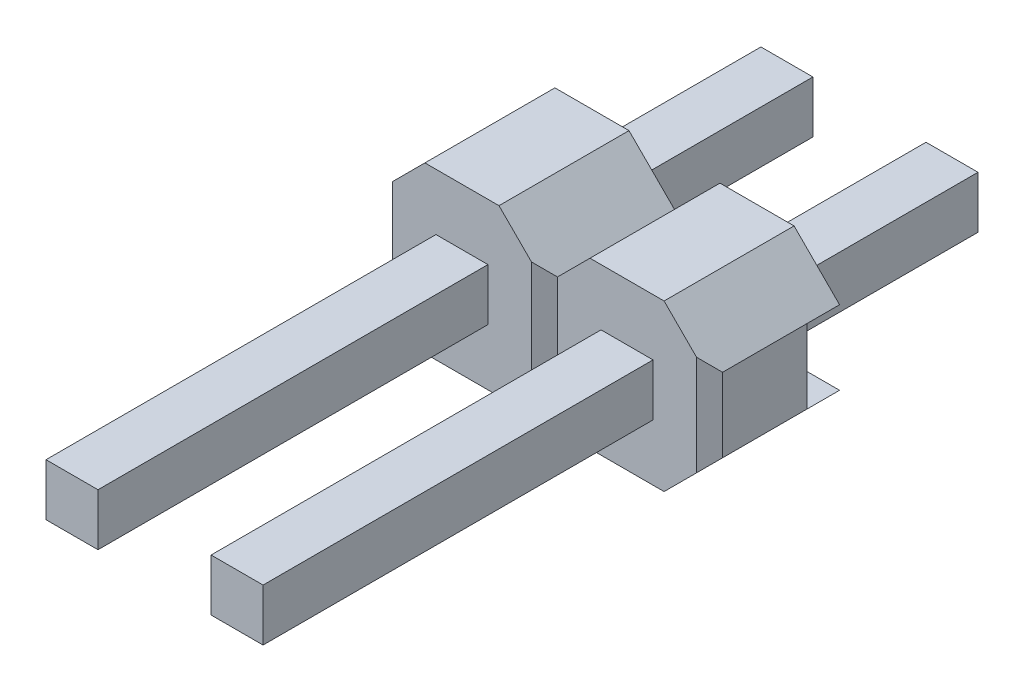
ISO-10303-21;
HEADER;
FILE_DESCRIPTION(('STEP AP214'),'2;1');
FILE_NAME('part.step','',(''),(''),'','','');
FILE_SCHEMA(('AUTOMOTIVE_DESIGN { 1 0 10303 214 1 1 1 1 }'));
ENDSEC;
DATA;
#1=APPLICATION_CONTEXT('core data for automotive mechanical design processes');
#2=APPLICATION_PROTOCOL_DEFINITION('international standard','automotive_design',2000,#1);
#3=PRODUCT_CONTEXT('',#1,'mechanical');
#4=PRODUCT('Part','Part','',(#3));
#5=PRODUCT_RELATED_PRODUCT_CATEGORY('part','',(#4));
#6=PRODUCT_DEFINITION_FORMATION('','',#4);
#7=PRODUCT_DEFINITION_CONTEXT('part definition',#1,'design');
#8=PRODUCT_DEFINITION('design','',#6,#7);
#9=PRODUCT_DEFINITION_SHAPE('','',#8);
#10=(LENGTH_UNIT() NAMED_UNIT(*) SI_UNIT(.MILLI.,.METRE.));
#11=(NAMED_UNIT(*) PLANE_ANGLE_UNIT() SI_UNIT($,.RADIAN.));
#12=(NAMED_UNIT(*) SI_UNIT($,.STERADIAN.) SOLID_ANGLE_UNIT());
#13=UNCERTAINTY_MEASURE_WITH_UNIT(LENGTH_MEASURE(1.E-05),#10,'distance_accuracy_value','');
#14=(GEOMETRIC_REPRESENTATION_CONTEXT(3) GLOBAL_UNCERTAINTY_ASSIGNED_CONTEXT((#13)) GLOBAL_UNIT_ASSIGNED_CONTEXT((#10,
#11,#12)) REPRESENTATION_CONTEXT('',''));
#15=CARTESIAN_POINT('',(0.,0.,0.));
#16=DIRECTION('',(0.,0.,1.));
#17=DIRECTION('',(1.,0.,0.));
#18=AXIS2_PLACEMENT_3D('',#15,#16,#17);
#19=CARTESIAN_POINT('',(-2.5654,-1.2954,0.));
#20=DIRECTION('',(0.,0.,-1.));
#21=DIRECTION('',(-1.,0.,0.));
#22=AXIS2_PLACEMENT_3D('',#19,#20,#21);
#23=PLANE('',#22);
#24=DIRECTION('',(0.707106781186547,-0.707106781186548,0.));
#25=VECTOR('',#24,1.);
#26=CARTESIAN_POINT('',(-0.7,1.27,0.));
#27=LINE('',#26,#25);
#28=CARTESIAN_POINT('',(-0.7,1.27,0.));
#29=VERTEX_POINT('',#28);
#30=CARTESIAN_POINT('',(0.,0.57,0.));
#31=VERTEX_POINT('',#30);
#32=EDGE_CURVE('P0_E101',#29,#31,#27,.T.);
#33=ORIENTED_EDGE('',*,*,#32,.T.);
#34=DIRECTION('',(1.,0.,0.));
#35=VECTOR('',#34,1.);
#36=CARTESIAN_POINT('',(0.,0.57,0.));
#37=LINE('',#36,#35);
#38=CARTESIAN_POINT('',(-2.54,0.57,0.));
#39=VERTEX_POINT('',#38);
#40=EDGE_CURVE('P0_E120',#39,#31,#37,.T.);
#41=ORIENTED_EDGE('',*,*,#40,.F.);
#42=DIRECTION('',(0.707106781186547,0.707106781186547,0.));
#43=VECTOR('',#42,1.);
#44=CARTESIAN_POINT('',(-2.54,0.57,0.));
#45=LINE('',#44,#43);
#46=CARTESIAN_POINT('',(-1.84,1.27,0.));
#47=VERTEX_POINT('',#46);
#48=EDGE_CURVE('P0_E18',#39,#47,#45,.T.);
#49=ORIENTED_EDGE('',*,*,#48,.T.);
#50=DIRECTION('',(-1.,0.,0.));
#51=VECTOR('',#50,1.);
#52=CARTESIAN_POINT('',(-2.5654,1.27,0.));
#53=LINE('',#52,#51);
#54=EDGE_CURVE('P0_E106',#47,#29,#53,.F.);
#55=ORIENTED_EDGE('',*,*,#54,.T.);
#56=EDGE_LOOP('',(#33,#41,#49,#55));
#57=FACE_BOUND('',#56,.T.);
#58=ADVANCED_FACE('P0_F15',(#57),#23,.T.);
#59=CARTESIAN_POINT('',(0.,0.57,0.));
#60=DIRECTION('',(0.,-1.,0.));
#61=DIRECTION('',(0.,0.,-1.));
#62=AXIS2_PLACEMENT_3D('',#59,#60,#61);
#63=PLANE('',#62);
#64=DIRECTION('',(0.,0.,-1.));
#65=VECTOR('',#64,1.);
#66=CARTESIAN_POINT('',(-2.54,0.57,0.));
#67=LINE('',#66,#65);
#68=CARTESIAN_POINT('',(-2.54,0.57,0.5));
#69=VERTEX_POINT('',#68);
#70=EDGE_CURVE('P0_E124',#69,#39,#67,.T.);
#71=ORIENTED_EDGE('',*,*,#70,.T.);
#72=ORIENTED_EDGE('',*,*,#40,.T.);
#73=DIRECTION('',(0.,0.,-1.));
#74=VECTOR('',#73,1.);
#75=CARTESIAN_POINT('',(0.,0.57,0.));
#76=LINE('',#75,#74);
#77=CARTESIAN_POINT('',(0.,0.57,0.5));
#78=VERTEX_POINT('',#77);
#79=EDGE_CURVE('P0_E132',#31,#78,#76,.F.);
#80=ORIENTED_EDGE('',*,*,#79,.T.);
#81=DIRECTION('',(-1.,0.,0.));
#82=VECTOR('',#81,1.);
#83=CARTESIAN_POINT('',(-2.54,0.57,0.5));
#84=LINE('',#83,#82);
#85=EDGE_CURVE('P0_E129',#69,#78,#84,.F.);
#86=ORIENTED_EDGE('',*,*,#85,.F.);
#87=EDGE_LOOP('',(#71,#72,#80,#86));
#88=FACE_BOUND('',#87,.T.);
#89=ADVANCED_FACE('P0_F127',(#88),#63,.T.);
#90=CARTESIAN_POINT('',(-2.54,-0.57,0.5));
#91=DIRECTION('',(0.,0.,-1.));
#92=DIRECTION('',(-1.,0.,0.));
#93=AXIS2_PLACEMENT_3D('',#90,#91,#92);
#94=PLANE('',#93);
#95=DIRECTION('',(0.,1.,0.));
#96=VECTOR('',#95,1.);
#97=CARTESIAN_POINT('',(0.,-0.57,0.5));
#98=LINE('',#97,#96);
#99=CARTESIAN_POINT('',(0.,-0.57,0.5));
#100=VERTEX_POINT('',#99);
#101=EDGE_CURVE('P0_E139',#78,#100,#98,.F.);
#102=ORIENTED_EDGE('',*,*,#101,.T.);
#103=DIRECTION('',(1.,0.,0.));
#104=VECTOR('',#103,1.);
#105=CARTESIAN_POINT('',(-2.54,-0.57,0.5));
#106=LINE('',#105,#104);
#107=CARTESIAN_POINT('',(-2.54,-0.57,0.5));
#108=VERTEX_POINT('',#107);
#109=EDGE_CURVE('P0_E144',#108,#100,#106,.T.);
#110=ORIENTED_EDGE('',*,*,#109,.F.);
#111=DIRECTION('',(0.,1.,0.));
#112=VECTOR('',#111,1.);
#113=CARTESIAN_POINT('',(-2.54,-0.57,0.5));
#114=LINE('',#113,#112);
#115=EDGE_CURVE('P0_E123',#108,#69,#114,.T.);
#116=ORIENTED_EDGE('',*,*,#115,.T.);
#117=ORIENTED_EDGE('',*,*,#85,.T.);
#118=EDGE_LOOP('',(#102,#110,#116,#117));
#119=FACE_BOUND('',#118,.T.);
#120=ADVANCED_FACE('P0_F266',(#119),#94,.T.);
#121=CARTESIAN_POINT('',(-2.54,-0.57,0.));
#122=DIRECTION('',(0.,1.,0.));
#123=DIRECTION('',(0.,0.,1.));
#124=AXIS2_PLACEMENT_3D('',#121,#122,#123);
#125=PLANE('',#124);
#126=DIRECTION('',(0.,0.,1.));
#127=VECTOR('',#126,1.);
#128=CARTESIAN_POINT('',(0.,-0.57,0.));
#129=LINE('',#128,#127);
#130=CARTESIAN_POINT('',(0.,-0.57,0.));
#131=VERTEX_POINT('',#130);
#132=EDGE_CURVE('P0_E147',#100,#131,#129,.F.);
#133=ORIENTED_EDGE('',*,*,#132,.T.);
#134=DIRECTION('',(-1.,0.,0.));
#135=VECTOR('',#134,1.);
#136=CARTESIAN_POINT('',(-2.5654,-0.570000000000001,0.));
#137=LINE('',#136,#135);
#138=CARTESIAN_POINT('',(-2.54,-0.570000000000001,0.));
#139=VERTEX_POINT('',#138);
#140=EDGE_CURVE('P0_E152',#139,#131,#137,.F.);
#141=ORIENTED_EDGE('',*,*,#140,.F.);
#142=DIRECTION('',(0.,0.,1.));
#143=VECTOR('',#142,1.);
#144=CARTESIAN_POINT('',(-2.54,-0.57,0.));
#145=LINE('',#144,#143);
#146=EDGE_CURVE('P0_E141',#139,#108,#145,.T.);
#147=ORIENTED_EDGE('',*,*,#146,.T.);
#148=ORIENTED_EDGE('',*,*,#109,.T.);
#149=EDGE_LOOP('',(#133,#141,#147,#148));
#150=FACE_BOUND('',#149,.T.);
#151=ADVANCED_FACE('P0_F263',(#150),#125,.T.);
#152=CARTESIAN_POINT('',(-2.5654,-1.2954,0.));
#153=DIRECTION('',(0.,0.,-1.));
#154=DIRECTION('',(-1.,0.,0.));
#155=AXIS2_PLACEMENT_3D('',#152,#153,#154);
#156=PLANE('',#155);
#157=DIRECTION('',(-0.707106781186548,0.707106781186547,0.));
#158=VECTOR('',#157,1.);
#159=CARTESIAN_POINT('',(-1.84,-1.27,0.));
#160=LINE('',#159,#158);
#161=CARTESIAN_POINT('',(-1.84,-1.27,0.));
#162=VERTEX_POINT('',#161);
#163=EDGE_CURVE('P0_E149',#162,#139,#160,.T.);
#164=ORIENTED_EDGE('',*,*,#163,.T.);
#165=ORIENTED_EDGE('',*,*,#140,.T.);
#166=DIRECTION('',(0.707106781186548,0.707106781186547,0.));
#167=VECTOR('',#166,1.);
#168=CARTESIAN_POINT('',(-0.7,-1.27,0.));
#169=LINE('',#168,#167);
#170=CARTESIAN_POINT('',(-0.7,-1.27,0.));
#171=VERTEX_POINT('',#170);
#172=EDGE_CURVE('P0_E157',#171,#131,#169,.T.);
#173=ORIENTED_EDGE('',*,*,#172,.F.);
#174=DIRECTION('',(1.,0.,0.));
#175=VECTOR('',#174,1.);
#176=CARTESIAN_POINT('',(0.,-1.27,0.));
#177=LINE('',#176,#175);
#178=EDGE_CURVE('P0_E166',#162,#171,#177,.T.);
#179=ORIENTED_EDGE('',*,*,#178,.F.);
#180=EDGE_LOOP('',(#164,#165,#173,#179));
#181=FACE_BOUND('',#180,.T.);
#182=ADVANCED_FACE('P0_F268',(#181),#156,.T.);
#183=CARTESIAN_POINT('',(-0.7,-1.27,16.));
#184=DIRECTION('',(0.707106781186547,-0.707106781186548,0.));
#185=DIRECTION('',(0.707106781186548,0.707106781186547,0.));
#186=AXIS2_PLACEMENT_3D('',#183,#184,#185);
#187=PLANE('',#186);
#188=DIRECTION('',(0.,0.,1.));
#189=VECTOR('',#188,1.);
#190=CARTESIAN_POINT('',(0.,-0.570000000000001,16.));
#191=LINE('',#190,#189);
#192=CARTESIAN_POINT('',(0.,-0.57,1.8));
#193=VERTEX_POINT('',#192);
#194=EDGE_CURVE('P0_E160',#100,#193,#191,.T.);
#195=ORIENTED_EDGE('',*,*,#194,.T.);
#196=DIRECTION('',(-0.577350269189626,-0.577350269189625,0.577350269189626));
#197=VECTOR('',#196,1.);
#198=CARTESIAN_POINT('',(0.,-0.570000000000001,1.8));
#199=LINE('',#198,#197);
#200=CARTESIAN_POINT('',(-0.2,-0.770000000000001,2.));
#201=VERTEX_POINT('',#200);
#202=EDGE_CURVE('P0_E163',#193,#201,#199,.T.);
#203=ORIENTED_EDGE('',*,*,#202,.T.);
#204=DIRECTION('',(0.707106781186548,0.707106781186547,0.));
#205=VECTOR('',#204,1.);
#206=CARTESIAN_POINT('',(-0.7,-1.27,2.));
#207=LINE('',#206,#205);
#208=CARTESIAN_POINT('',(-0.7,-1.27,2.));
#209=VERTEX_POINT('',#208);
#210=EDGE_CURVE('P0_E155',#201,#209,#207,.F.);
#211=ORIENTED_EDGE('',*,*,#210,.T.);
#212=DIRECTION('',(0.,0.,-1.));
#213=VECTOR('',#212,1.);
#214=CARTESIAN_POINT('',(-0.7,-1.27,0.));
#215=LINE('',#214,#213);
#216=EDGE_CURVE('P0_E169',#171,#209,#215,.F.);
#217=ORIENTED_EDGE('',*,*,#216,.F.);
#218=ORIENTED_EDGE('',*,*,#172,.T.);
#219=ORIENTED_EDGE('',*,*,#132,.F.);
#220=EDGE_LOOP('',(#195,#203,#211,#217,#218,#219));
#221=FACE_BOUND('',#220,.T.);
#222=ADVANCED_FACE('P0_F257',(#221),#187,.T.);
#223=CARTESIAN_POINT('',(0.,-1.27,0.));
#224=DIRECTION('',(0.,-1.,0.));
#225=DIRECTION('',(0.,0.,-1.));
#226=AXIS2_PLACEMENT_3D('',#223,#224,#225);
#227=PLANE('',#226);
#228=ORIENTED_EDGE('',*,*,#216,.T.);
#229=DIRECTION('',(1.,0.,0.));
#230=VECTOR('',#229,1.);
#231=CARTESIAN_POINT('',(0.,-1.27,2.));
#232=LINE('',#231,#230);
#233=CARTESIAN_POINT('',(-1.84,-1.27,2.));
#234=VERTEX_POINT('',#233);
#235=EDGE_CURVE('P0_E172',#209,#234,#232,.F.);
#236=ORIENTED_EDGE('',*,*,#235,.T.);
#237=DIRECTION('',(0.,0.,1.));
#238=VECTOR('',#237,1.);
#239=CARTESIAN_POINT('',(-1.84,-1.27,16.));
#240=LINE('',#239,#238);
#241=EDGE_CURVE('P0_E174',#162,#234,#240,.T.);
#242=ORIENTED_EDGE('',*,*,#241,.F.);
#243=ORIENTED_EDGE('',*,*,#178,.T.);
#244=EDGE_LOOP('',(#228,#236,#242,#243));
#245=FACE_BOUND('',#244,.T.);
#246=ADVANCED_FACE('P0_F253',(#245),#227,.T.);
#247=CARTESIAN_POINT('',(-2.54,-0.570000000000001,16.));
#248=DIRECTION('',(-0.707106781186548,-0.707106781186547,0.));
#249=DIRECTION('',(0.707106781186547,-0.707106781186548,0.));
#250=AXIS2_PLACEMENT_3D('',#247,#248,#249);
#251=PLANE('',#250);
#252=DIRECTION('',(0.707106781186547,-0.707106781186548,0.));
#253=VECTOR('',#252,1.);
#254=CARTESIAN_POINT('',(-2.54,-0.570000000000001,2.));
#255=LINE('',#254,#253);
#256=CARTESIAN_POINT('',(-2.34,-0.77,2.));
#257=VERTEX_POINT('',#256);
#258=EDGE_CURVE('P0_E177',#234,#257,#255,.F.);
#259=ORIENTED_EDGE('',*,*,#258,.T.);
#260=DIRECTION('',(-0.577350269189625,0.577350269189626,-0.577350269189626));
#261=VECTOR('',#260,1.);
#262=CARTESIAN_POINT('',(-2.34,-0.770000000000001,2.));
#263=LINE('',#262,#261);
#264=CARTESIAN_POINT('',(-2.54,-0.57,1.8));
#265=VERTEX_POINT('',#264);
#266=EDGE_CURVE('P0_E180',#257,#265,#263,.T.);
#267=ORIENTED_EDGE('',*,*,#266,.T.);
#268=DIRECTION('',(0.,0.,1.));
#269=VECTOR('',#268,1.);
#270=CARTESIAN_POINT('',(-2.54,-0.57,0.));
#271=LINE('',#270,#269);
#272=EDGE_CURVE('P0_E190',#108,#265,#271,.T.);
#273=ORIENTED_EDGE('',*,*,#272,.F.);
#274=ORIENTED_EDGE('',*,*,#146,.F.);
#275=ORIENTED_EDGE('',*,*,#163,.F.);
#276=ORIENTED_EDGE('',*,*,#241,.T.);
#277=EDGE_LOOP('',(#259,#267,#273,#274,#275,#276));
#278=FACE_BOUND('',#277,.T.);
#279=ADVANCED_FACE('P0_F223',(#278),#251,.T.);
#280=CARTESIAN_POINT('',(0.,1.27,0.));
#281=DIRECTION('',(1.,0.,0.));
#282=DIRECTION('',(0.,0.,-1.));
#283=AXIS2_PLACEMENT_3D('',#280,#281,#282);
#284=PLANE('',#283);
#285=DIRECTION('',(0.,1.,0.));
#286=VECTOR('',#285,1.);
#287=CARTESIAN_POINT('',(0.,4.60999999999997,1.8));
#288=LINE('',#287,#286);
#289=CARTESIAN_POINT('',(0.,0.57,1.8));
#290=VERTEX_POINT('',#289);
#291=EDGE_CURVE('P0_E198',#193,#290,#288,.T.);
#292=ORIENTED_EDGE('',*,*,#291,.F.);
#293=ORIENTED_EDGE('',*,*,#194,.F.);
#294=ORIENTED_EDGE('',*,*,#101,.F.);
#295=DIRECTION('',(0.,0.,1.));
#296=VECTOR('',#295,1.);
#297=CARTESIAN_POINT('',(0.,0.57,16.));
#298=LINE('',#297,#296);
#299=EDGE_CURVE('P0_E182',#290,#78,#298,.F.);
#300=ORIENTED_EDGE('',*,*,#299,.F.);
#301=EDGE_LOOP('',(#292,#293,#294,#300));
#302=FACE_BOUND('',#301,.T.);
#303=ADVANCED_FACE('P0_F214',(#302),#284,.T.);
#304=CARTESIAN_POINT('',(0.,0.569999999999999,16.));
#305=DIRECTION('',(0.707106781186548,0.707106781186547,0.));
#306=DIRECTION('',(-0.707106781186547,0.707106781186548,0.));
#307=AXIS2_PLACEMENT_3D('',#304,#305,#306);
#308=PLANE('',#307);
#309=DIRECTION('',(-0.707106781186547,0.707106781186548,0.));
#310=VECTOR('',#309,1.);
#311=CARTESIAN_POINT('',(0.,0.569999999999999,2.));
#312=LINE('',#311,#310);
#313=CARTESIAN_POINT('',(-0.7,1.27,2.));
#314=VERTEX_POINT('',#313);
#315=CARTESIAN_POINT('',(-0.200000000000001,0.770000000000001,2.));
#316=VERTEX_POINT('',#315);
#317=EDGE_CURVE('P0_E185',#314,#316,#312,.F.);
#318=ORIENTED_EDGE('',*,*,#317,.T.);
#319=DIRECTION('',(-0.577350269189625,0.577350269189628,0.577350269189625));
#320=VECTOR('',#319,1.);
#321=CARTESIAN_POINT('',(0.,0.57,1.8));
#322=LINE('',#321,#320);
#323=EDGE_CURVE('P0_E195',#290,#316,#322,.T.);
#324=ORIENTED_EDGE('',*,*,#323,.F.);
#325=ORIENTED_EDGE('',*,*,#299,.T.);
#326=ORIENTED_EDGE('',*,*,#79,.F.);
#327=ORIENTED_EDGE('',*,*,#32,.F.);
#328=DIRECTION('',(0.,0.,1.));
#329=VECTOR('',#328,1.);
#330=CARTESIAN_POINT('',(-0.699999999999999,1.27,0.));
#331=LINE('',#330,#329);
#332=EDGE_CURVE('P0_E111',#314,#29,#331,.F.);
#333=ORIENTED_EDGE('',*,*,#332,.F.);
#334=EDGE_LOOP('',(#318,#324,#325,#326,#327,#333));
#335=FACE_BOUND('',#334,.T.);
#336=ADVANCED_FACE('P0_F212',(#335),#308,.T.);
#337=CARTESIAN_POINT('',(-2.54,0.57,-14.));
#338=DIRECTION('',(-0.707106781186548,0.707106781186547,0.));
#339=DIRECTION('',(-0.707106781186547,-0.707106781186548,0.));
#340=AXIS2_PLACEMENT_3D('',#337,#338,#339);
#341=PLANE('',#340);
#342=DIRECTION('',(0.,0.,1.));
#343=VECTOR('',#342,1.);
#344=CARTESIAN_POINT('',(-2.54,0.57,0.));
#345=LINE('',#344,#343);
#346=CARTESIAN_POINT('',(-2.54,0.57,1.8));
#347=VERTEX_POINT('',#346);
#348=EDGE_CURVE('P0_E193',#347,#69,#345,.F.);
#349=ORIENTED_EDGE('',*,*,#348,.F.);
#350=DIRECTION('',(0.577350269189627,0.577350269189628,0.577350269189622));
#351=VECTOR('',#350,1.);
#352=CARTESIAN_POINT('',(-2.54,0.57,1.8));
#353=LINE('',#352,#351);
#354=CARTESIAN_POINT('',(-2.34,0.770000000000001,2.));
#355=VERTEX_POINT('',#354);
#356=EDGE_CURVE('P0_E188',#347,#355,#353,.T.);
#357=ORIENTED_EDGE('',*,*,#356,.T.);
#358=DIRECTION('',(-0.707106781186547,-0.707106781186548,0.));
#359=VECTOR('',#358,1.);
#360=CARTESIAN_POINT('',(-2.54,0.57,2.));
#361=LINE('',#360,#359);
#362=CARTESIAN_POINT('',(-1.84,1.27,2.));
#363=VERTEX_POINT('',#362);
#364=EDGE_CURVE('P0_E33',#355,#363,#361,.F.);
#365=ORIENTED_EDGE('',*,*,#364,.T.);
#366=DIRECTION('',(0.,0.,1.));
#367=VECTOR('',#366,1.);
#368=CARTESIAN_POINT('',(-1.84,1.27,0.));
#369=LINE('',#368,#367);
#370=EDGE_CURVE('P0_E109',#47,#363,#369,.T.);
#371=ORIENTED_EDGE('',*,*,#370,.F.);
#372=ORIENTED_EDGE('',*,*,#48,.F.);
#373=ORIENTED_EDGE('',*,*,#70,.F.);
#374=EDGE_LOOP('',(#349,#357,#365,#371,#372,#373));
#375=FACE_BOUND('',#374,.T.);
#376=ADVANCED_FACE('P0_F115',(#375),#341,.T.);
#377=CARTESIAN_POINT('',(-2.54,-1.27,0.));
#378=DIRECTION('',(-1.,0.,0.));
#379=DIRECTION('',(0.,0.,1.));
#380=AXIS2_PLACEMENT_3D('',#377,#378,#379);
#381=PLANE('',#380);
#382=DIRECTION('',(0.,1.,0.));
#383=VECTOR('',#382,1.);
#384=CARTESIAN_POINT('',(-2.54,-4.57,1.8));
#385=LINE('',#384,#383);
#386=EDGE_CURVE('P0_E117',#347,#265,#385,.F.);
#387=ORIENTED_EDGE('',*,*,#386,.F.);
#388=ORIENTED_EDGE('',*,*,#348,.T.);
#389=ORIENTED_EDGE('',*,*,#115,.F.);
#390=ORIENTED_EDGE('',*,*,#272,.T.);
#391=EDGE_LOOP('',(#387,#388,#389,#390));
#392=FACE_BOUND('',#391,.T.);
#393=ADVANCED_FACE('P0_F221',(#392),#381,.T.);
#394=CARTESIAN_POINT('',(0.,4.60999999999997,1.8));
#395=DIRECTION('',(0.707106781186547,0.,0.707106781186548));
#396=DIRECTION('',(0.707106781186548,0.,-0.707106781186547));
#397=AXIS2_PLACEMENT_3D('',#394,#395,#396);
#398=PLANE('',#397);
#399=ORIENTED_EDGE('',*,*,#202,.F.);
#400=ORIENTED_EDGE('',*,*,#291,.T.);
#401=ORIENTED_EDGE('',*,*,#323,.T.);
#402=DIRECTION('',(0.,1.,0.));
#403=VECTOR('',#402,1.);
#404=CARTESIAN_POINT('',(-0.2,-1.2954,2.));
#405=LINE('',#404,#403);
#406=EDGE_CURVE('P0_E204',#201,#316,#405,.T.);
#407=ORIENTED_EDGE('',*,*,#406,.F.);
#408=EDGE_LOOP('',(#399,#400,#401,#407));
#409=FACE_BOUND('',#408,.T.);
#410=ADVANCED_FACE('P0_F237',(#409),#398,.T.);
#411=CARTESIAN_POINT('',(-2.54,1.27,0.));
#412=DIRECTION('',(0.,1.,0.));
#413=DIRECTION('',(0.,0.,1.));
#414=AXIS2_PLACEMENT_3D('',#411,#412,#413);
#415=PLANE('',#414);
#416=ORIENTED_EDGE('',*,*,#370,.T.);
#417=DIRECTION('',(1.,0.,0.));
#418=VECTOR('',#417,1.);
#419=CARTESIAN_POINT('',(-2.5654,1.27,2.));
#420=LINE('',#419,#418);
#421=EDGE_CURVE('P0_E24',#314,#363,#420,.F.);
#422=ORIENTED_EDGE('',*,*,#421,.F.);
#423=ORIENTED_EDGE('',*,*,#332,.T.);
#424=ORIENTED_EDGE('',*,*,#54,.F.);
#425=EDGE_LOOP('',(#416,#422,#423,#424));
#426=FACE_BOUND('',#425,.T.);
#427=ADVANCED_FACE('P0_F107',(#426),#415,.T.);
#428=CARTESIAN_POINT('',(-2.54,-4.57,1.8));
#429=DIRECTION('',(-0.707106781186548,0.,0.707106781186547));
#430=DIRECTION('',(0.707106781186547,0.,0.707106781186548));
#431=AXIS2_PLACEMENT_3D('',#428,#429,#430);
#432=PLANE('',#431);
#433=ORIENTED_EDGE('',*,*,#356,.F.);
#434=ORIENTED_EDGE('',*,*,#386,.T.);
#435=ORIENTED_EDGE('',*,*,#266,.F.);
#436=DIRECTION('',(0.,1.,0.));
#437=VECTOR('',#436,1.);
#438=CARTESIAN_POINT('',(-2.34,-1.2954,2.));
#439=LINE('',#438,#437);
#440=EDGE_CURVE('P0_E10',#355,#257,#439,.F.);
#441=ORIENTED_EDGE('',*,*,#440,.F.);
#442=EDGE_LOOP('',(#433,#434,#435,#441));
#443=FACE_BOUND('',#442,.T.);
#444=ADVANCED_FACE('P0_F227',(#443),#432,.T.);
#445=CARTESIAN_POINT('',(-2.5654,-1.2954,2.));
#446=DIRECTION('',(0.,0.,1.));
#447=DIRECTION('',(1.,0.,0.));
#448=AXIS2_PLACEMENT_3D('',#445,#446,#447);
#449=PLANE('',#448);
#450=ORIENTED_EDGE('',*,*,#364,.F.);
#451=ORIENTED_EDGE('',*,*,#440,.T.);
#452=ORIENTED_EDGE('',*,*,#258,.F.);
#453=ORIENTED_EDGE('',*,*,#235,.F.);
#454=ORIENTED_EDGE('',*,*,#210,.F.);
#455=ORIENTED_EDGE('',*,*,#406,.T.);
#456=ORIENTED_EDGE('',*,*,#317,.F.);
#457=ORIENTED_EDGE('',*,*,#421,.T.);
#458=EDGE_LOOP('',(#450,#451,#452,#453,#454,#455,#456,#457));
#459=FACE_BOUND('',#458,.T.);
#460=ADVANCED_FACE('P0_F208',(#459),#449,.T.);
#461=CLOSED_SHELL('',(#58,#89,#120,#151,#182,#222,#246,#279,#303,#336,#376,#393,#410,#427,#444,#460));
#462=MANIFOLD_SOLID_BREP('P0_B1',#461);
#463=CARTESIAN_POINT('',(0.86,-0.41,-3.));
#464=DIRECTION('',(0.,0.,-1.));
#465=DIRECTION('',(-1.,0.,0.));
#466=AXIS2_PLACEMENT_3D('',#463,#464,#465);
#467=PLANE('',#466);
#468=DIRECTION('',(-1.,0.,0.));
#469=VECTOR('',#468,1.);
#470=CARTESIAN_POINT('',(0.86,0.4,-3.));
#471=LINE('',#470,#469);
#472=CARTESIAN_POINT('',(0.87,0.4,-3.));
#473=VERTEX_POINT('',#472);
#474=CARTESIAN_POINT('',(1.67,0.4,-3.));
#475=VERTEX_POINT('',#474);
#476=EDGE_CURVE('P1_E66',#473,#475,#471,.F.);
#477=ORIENTED_EDGE('',*,*,#476,.T.);
#478=DIRECTION('',(0.,1.,0.));
#479=VECTOR('',#478,1.);
#480=CARTESIAN_POINT('',(1.67,0.399999999999999,-3.));
#481=LINE('',#480,#479);
#482=CARTESIAN_POINT('',(1.67,-0.4,-3.));
#483=VERTEX_POINT('',#482);
#484=EDGE_CURVE('P1_E71',#483,#475,#481,.T.);
#485=ORIENTED_EDGE('',*,*,#484,.F.);
#486=DIRECTION('',(1.,0.,0.));
#487=VECTOR('',#486,1.);
#488=CARTESIAN_POINT('',(1.67,-0.4,-3.));
#489=LINE('',#488,#487);
#490=CARTESIAN_POINT('',(0.87,-0.4,-3.));
#491=VERTEX_POINT('',#490);
#492=EDGE_CURVE('P1_E73',#491,#483,#489,.T.);
#493=ORIENTED_EDGE('',*,*,#492,.F.);
#494=DIRECTION('',(0.,1.,0.));
#495=VECTOR('',#494,1.);
#496=CARTESIAN_POINT('',(0.87,-0.41,-3.));
#497=LINE('',#496,#495);
#498=EDGE_CURVE('P1_E19',#491,#473,#497,.T.);
#499=ORIENTED_EDGE('',*,*,#498,.T.);
#500=EDGE_LOOP('',(#477,#485,#493,#499));
#501=FACE_BOUND('',#500,.T.);
#502=ADVANCED_FACE('P1_F16',(#501),#467,.T.);
#503=CARTESIAN_POINT('',(1.67,-0.4,0.));
#504=DIRECTION('',(0.,-1.,0.));
#505=DIRECTION('',(0.,0.,-1.));
#506=AXIS2_PLACEMENT_3D('',#503,#504,#505);
#507=PLANE('',#506);
#508=DIRECTION('',(0.,0.,1.));
#509=VECTOR('',#508,1.);
#510=CARTESIAN_POINT('',(0.87,-0.399999999999999,0.));
#511=LINE('',#510,#509);
#512=CARTESIAN_POINT('',(0.87,-0.399999999999999,8.));
#513=VERTEX_POINT('',#512);
#514=EDGE_CURVE('P1_E76',#491,#513,#511,.T.);
#515=ORIENTED_EDGE('',*,*,#514,.F.);
#516=ORIENTED_EDGE('',*,*,#492,.T.);
#517=DIRECTION('',(0.,0.,-1.));
#518=VECTOR('',#517,1.);
#519=CARTESIAN_POINT('',(1.67,-0.4,0.));
#520=LINE('',#519,#518);
#521=CARTESIAN_POINT('',(1.67,-0.4,8.));
#522=VERTEX_POINT('',#521);
#523=EDGE_CURVE('P1_E64',#522,#483,#520,.T.);
#524=ORIENTED_EDGE('',*,*,#523,.F.);
#525=DIRECTION('',(1.,0.,0.));
#526=VECTOR('',#525,1.);
#527=CARTESIAN_POINT('',(0.86,-0.399999999999999,8.));
#528=LINE('',#527,#526);
#529=EDGE_CURVE('P1_E82',#513,#522,#528,.T.);
#530=ORIENTED_EDGE('',*,*,#529,.F.);
#531=EDGE_LOOP('',(#515,#516,#524,#530));
#532=FACE_BOUND('',#531,.T.);
#533=ADVANCED_FACE('P1_F88',(#532),#507,.T.);
#534=CARTESIAN_POINT('',(0.87,-0.399999999999999,0.));
#535=DIRECTION('',(-1.,0.,0.));
#536=DIRECTION('',(0.,0.,1.));
#537=AXIS2_PLACEMENT_3D('',#534,#535,#536);
#538=PLANE('',#537);
#539=DIRECTION('',(0.,0.,1.));
#540=VECTOR('',#539,1.);
#541=CARTESIAN_POINT('',(0.87,0.4,0.));
#542=LINE('',#541,#540);
#543=CARTESIAN_POINT('',(0.87,0.4,8.));
#544=VERTEX_POINT('',#543);
#545=EDGE_CURVE('P1_E58',#473,#544,#542,.T.);
#546=ORIENTED_EDGE('',*,*,#545,.F.);
#547=ORIENTED_EDGE('',*,*,#498,.F.);
#548=ORIENTED_EDGE('',*,*,#514,.T.);
#549=DIRECTION('',(0.,1.,0.));
#550=VECTOR('',#549,1.);
#551=CARTESIAN_POINT('',(0.87,-0.41,8.));
#552=LINE('',#551,#550);
#553=EDGE_CURVE('P1_E63',#544,#513,#552,.F.);
#554=ORIENTED_EDGE('',*,*,#553,.F.);
#555=EDGE_LOOP('',(#546,#547,#548,#554));
#556=FACE_BOUND('',#555,.T.);
#557=ADVANCED_FACE('P1_F59',(#556),#538,.T.);
#558=CARTESIAN_POINT('',(0.86,-0.41,8.));
#559=DIRECTION('',(0.,0.,1.));
#560=DIRECTION('',(1.,0.,0.));
#561=AXIS2_PLACEMENT_3D('',#558,#559,#560);
#562=PLANE('',#561);
#563=ORIENTED_EDGE('',*,*,#553,.T.);
#564=ORIENTED_EDGE('',*,*,#529,.T.);
#565=DIRECTION('',(0.,1.,0.));
#566=VECTOR('',#565,1.);
#567=CARTESIAN_POINT('',(1.67,0.399999999999999,8.));
#568=LINE('',#567,#566);
#569=CARTESIAN_POINT('',(1.67,0.399999999999999,8.));
#570=VERTEX_POINT('',#569);
#571=EDGE_CURVE('P1_E34',#570,#522,#568,.F.);
#572=ORIENTED_EDGE('',*,*,#571,.F.);
#573=DIRECTION('',(1.,0.,0.));
#574=VECTOR('',#573,1.);
#575=CARTESIAN_POINT('',(0.87,0.4,8.));
#576=LINE('',#575,#574);
#577=EDGE_CURVE('P1_E25',#544,#570,#576,.T.);
#578=ORIENTED_EDGE('',*,*,#577,.F.);
#579=EDGE_LOOP('',(#563,#564,#572,#578));
#580=FACE_BOUND('',#579,.T.);
#581=ADVANCED_FACE('P1_F86',(#580),#562,.T.);
#582=CARTESIAN_POINT('',(1.67,0.399999999999999,0.));
#583=DIRECTION('',(1.,0.,0.));
#584=DIRECTION('',(0.,0.,-1.));
#585=AXIS2_PLACEMENT_3D('',#582,#583,#584);
#586=PLANE('',#585);
#587=ORIENTED_EDGE('',*,*,#523,.T.);
#588=ORIENTED_EDGE('',*,*,#484,.T.);
#589=DIRECTION('',(0.,0.,1.));
#590=VECTOR('',#589,1.);
#591=CARTESIAN_POINT('',(1.67,0.4,0.));
#592=LINE('',#591,#590);
#593=EDGE_CURVE('P1_E11',#570,#475,#592,.F.);
#594=ORIENTED_EDGE('',*,*,#593,.F.);
#595=ORIENTED_EDGE('',*,*,#571,.T.);
#596=EDGE_LOOP('',(#587,#588,#594,#595));
#597=FACE_BOUND('',#596,.T.);
#598=ADVANCED_FACE('P1_F90',(#597),#586,.T.);
#599=CARTESIAN_POINT('',(0.87,0.4,0.));
#600=DIRECTION('',(0.,1.,0.));
#601=DIRECTION('',(0.,0.,1.));
#602=AXIS2_PLACEMENT_3D('',#599,#600,#601);
#603=PLANE('',#602);
#604=ORIENTED_EDGE('',*,*,#593,.T.);
#605=ORIENTED_EDGE('',*,*,#476,.F.);
#606=ORIENTED_EDGE('',*,*,#545,.T.);
#607=ORIENTED_EDGE('',*,*,#577,.T.);
#608=EDGE_LOOP('',(#604,#605,#606,#607));
#609=FACE_BOUND('',#608,.T.);
#610=ADVANCED_FACE('P1_F67',(#609),#603,.T.);
#611=CLOSED_SHELL('',(#502,#533,#557,#581,#598,#610));
#612=MANIFOLD_SOLID_BREP('P1_B1',#611);
#613=CARTESIAN_POINT('',(-0.0254,-1.2954,0.));
#614=DIRECTION('',(0.,0.,-1.));
#615=DIRECTION('',(-1.,0.,0.));
#616=AXIS2_PLACEMENT_3D('',#613,#614,#615);
#617=PLANE('',#616);
#618=DIRECTION('',(0.707106781186547,-0.707106781186548,0.));
#619=VECTOR('',#618,1.);
#620=CARTESIAN_POINT('',(1.84,1.27,0.));
#621=LINE('',#620,#619);
#622=CARTESIAN_POINT('',(1.84,1.27,0.));
#623=VERTEX_POINT('',#622);
#624=CARTESIAN_POINT('',(2.54,0.57,0.));
#625=VERTEX_POINT('',#624);
#626=EDGE_CURVE('P2_E102',#623,#625,#621,.T.);
#627=ORIENTED_EDGE('',*,*,#626,.T.);
#628=DIRECTION('',(1.,0.,0.));
#629=VECTOR('',#628,1.);
#630=CARTESIAN_POINT('',(2.54,0.57,0.));
#631=LINE('',#630,#629);
#632=CARTESIAN_POINT('',(0.,0.57,0.));
#633=VERTEX_POINT('',#632);
#634=EDGE_CURVE('P2_E121',#633,#625,#631,.T.);
#635=ORIENTED_EDGE('',*,*,#634,.F.);
#636=DIRECTION('',(0.707106781186547,0.707106781186548,0.));
#637=VECTOR('',#636,1.);
#638=CARTESIAN_POINT('',(0.,0.57,0.));
#639=LINE('',#638,#637);
#640=CARTESIAN_POINT('',(0.699999999999999,1.27,0.));
#641=VERTEX_POINT('',#640);
#642=EDGE_CURVE('P2_E19',#633,#641,#639,.T.);
#643=ORIENTED_EDGE('',*,*,#642,.T.);
#644=DIRECTION('',(-1.,0.,0.));
#645=VECTOR('',#644,1.);
#646=CARTESIAN_POINT('',(-0.0254,1.27,0.));
#647=LINE('',#646,#645);
#648=EDGE_CURVE('P2_E107',#641,#623,#647,.F.);
#649=ORIENTED_EDGE('',*,*,#648,.T.);
#650=EDGE_LOOP('',(#627,#635,#643,#649));
#651=FACE_BOUND('',#650,.T.);
#652=ADVANCED_FACE('P2_F16',(#651),#617,.T.);
#653=CARTESIAN_POINT('',(2.54,0.57,0.));
#654=DIRECTION('',(0.,-1.,0.));
#655=DIRECTION('',(0.,0.,-1.));
#656=AXIS2_PLACEMENT_3D('',#653,#654,#655);
#657=PLANE('',#656);
#658=DIRECTION('',(0.,0.,-1.));
#659=VECTOR('',#658,1.);
#660=CARTESIAN_POINT('',(0.,0.57,0.));
#661=LINE('',#660,#659);
#662=CARTESIAN_POINT('',(0.,0.57,0.5));
#663=VERTEX_POINT('',#662);
#664=EDGE_CURVE('P2_E125',#663,#633,#661,.T.);
#665=ORIENTED_EDGE('',*,*,#664,.T.);
#666=ORIENTED_EDGE('',*,*,#634,.T.);
#667=DIRECTION('',(0.,0.,-1.));
#668=VECTOR('',#667,1.);
#669=CARTESIAN_POINT('',(2.54,0.57,0.));
#670=LINE('',#669,#668);
#671=CARTESIAN_POINT('',(2.54,0.57,0.5));
#672=VERTEX_POINT('',#671);
#673=EDGE_CURVE('P2_E133',#625,#672,#670,.F.);
#674=ORIENTED_EDGE('',*,*,#673,.T.);
#675=DIRECTION('',(-1.,0.,0.));
#676=VECTOR('',#675,1.);
#677=CARTESIAN_POINT('',(0.,0.57,0.5));
#678=LINE('',#677,#676);
#679=EDGE_CURVE('P2_E130',#663,#672,#678,.F.);
#680=ORIENTED_EDGE('',*,*,#679,.F.);
#681=EDGE_LOOP('',(#665,#666,#674,#680));
#682=FACE_BOUND('',#681,.T.);
#683=ADVANCED_FACE('P2_F128',(#682),#657,.T.);
#684=CARTESIAN_POINT('',(0.,-0.57,0.5));
#685=DIRECTION('',(0.,0.,-1.));
#686=DIRECTION('',(-1.,0.,0.));
#687=AXIS2_PLACEMENT_3D('',#684,#685,#686);
#688=PLANE('',#687);
#689=DIRECTION('',(0.,1.,0.));
#690=VECTOR('',#689,1.);
#691=CARTESIAN_POINT('',(2.54,-0.57,0.5));
#692=LINE('',#691,#690);
#693=CARTESIAN_POINT('',(2.54,-0.57,0.5));
#694=VERTEX_POINT('',#693);
#695=EDGE_CURVE('P2_E140',#672,#694,#692,.F.);
#696=ORIENTED_EDGE('',*,*,#695,.T.);
#697=DIRECTION('',(1.,0.,0.));
#698=VECTOR('',#697,1.);
#699=CARTESIAN_POINT('',(0.,-0.57,0.5));
#700=LINE('',#699,#698);
#701=CARTESIAN_POINT('',(0.,-0.57,0.5));
#702=VERTEX_POINT('',#701);
#703=EDGE_CURVE('P2_E145',#702,#694,#700,.T.);
#704=ORIENTED_EDGE('',*,*,#703,.F.);
#705=DIRECTION('',(0.,1.,0.));
#706=VECTOR('',#705,1.);
#707=CARTESIAN_POINT('',(0.,-0.57,0.5));
#708=LINE('',#707,#706);
#709=EDGE_CURVE('P2_E124',#702,#663,#708,.T.);
#710=ORIENTED_EDGE('',*,*,#709,.T.);
#711=ORIENTED_EDGE('',*,*,#679,.T.);
#712=EDGE_LOOP('',(#696,#704,#710,#711));
#713=FACE_BOUND('',#712,.T.);
#714=ADVANCED_FACE('P2_F267',(#713),#688,.T.);
#715=CARTESIAN_POINT('',(0.,-0.57,0.));
#716=DIRECTION('',(0.,1.,0.));
#717=DIRECTION('',(0.,0.,1.));
#718=AXIS2_PLACEMENT_3D('',#715,#716,#717);
#719=PLANE('',#718);
#720=DIRECTION('',(0.,0.,1.));
#721=VECTOR('',#720,1.);
#722=CARTESIAN_POINT('',(2.54,-0.57,0.));
#723=LINE('',#722,#721);
#724=CARTESIAN_POINT('',(2.54,-0.57,0.));
#725=VERTEX_POINT('',#724);
#726=EDGE_CURVE('P2_E148',#694,#725,#723,.F.);
#727=ORIENTED_EDGE('',*,*,#726,.T.);
#728=DIRECTION('',(-1.,0.,0.));
#729=VECTOR('',#728,1.);
#730=CARTESIAN_POINT('',(-0.0254,-0.570000000000001,0.));
#731=LINE('',#730,#729);
#732=CARTESIAN_POINT('',(0.,-0.57,0.));
#733=VERTEX_POINT('',#732);
#734=EDGE_CURVE('P2_E153',#733,#725,#731,.F.);
#735=ORIENTED_EDGE('',*,*,#734,.F.);
#736=DIRECTION('',(0.,0.,1.));
#737=VECTOR('',#736,1.);
#738=CARTESIAN_POINT('',(0.,-0.57,0.));
#739=LINE('',#738,#737);
#740=EDGE_CURVE('P2_E142',#733,#702,#739,.T.);
#741=ORIENTED_EDGE('',*,*,#740,.T.);
#742=ORIENTED_EDGE('',*,*,#703,.T.);
#743=EDGE_LOOP('',(#727,#735,#741,#742));
#744=FACE_BOUND('',#743,.T.);
#745=ADVANCED_FACE('P2_F264',(#744),#719,.T.);
#746=CARTESIAN_POINT('',(-0.0254,-1.2954,0.));
#747=DIRECTION('',(0.,0.,-1.));
#748=DIRECTION('',(-1.,0.,0.));
#749=AXIS2_PLACEMENT_3D('',#746,#747,#748);
#750=PLANE('',#749);
#751=DIRECTION('',(-0.707106781186548,0.707106781186547,0.));
#752=VECTOR('',#751,1.);
#753=CARTESIAN_POINT('',(0.7,-1.27,0.));
#754=LINE('',#753,#752);
#755=CARTESIAN_POINT('',(0.7,-1.27,0.));
#756=VERTEX_POINT('',#755);
#757=EDGE_CURVE('P2_E150',#756,#733,#754,.T.);
#758=ORIENTED_EDGE('',*,*,#757,.T.);
#759=ORIENTED_EDGE('',*,*,#734,.T.);
#760=DIRECTION('',(0.707106781186547,0.707106781186548,0.));
#761=VECTOR('',#760,1.);
#762=CARTESIAN_POINT('',(1.84,-1.27,0.));
#763=LINE('',#762,#761);
#764=CARTESIAN_POINT('',(1.84,-1.27,0.));
#765=VERTEX_POINT('',#764);
#766=EDGE_CURVE('P2_E158',#765,#725,#763,.T.);
#767=ORIENTED_EDGE('',*,*,#766,.F.);
#768=DIRECTION('',(1.,0.,0.));
#769=VECTOR('',#768,1.);
#770=CARTESIAN_POINT('',(2.54,-1.27,0.));
#771=LINE('',#770,#769);
#772=EDGE_CURVE('P2_E167',#756,#765,#771,.T.);
#773=ORIENTED_EDGE('',*,*,#772,.F.);
#774=EDGE_LOOP('',(#758,#759,#767,#773));
#775=FACE_BOUND('',#774,.T.);
#776=ADVANCED_FACE('P2_F269',(#775),#750,.T.);
#777=CARTESIAN_POINT('',(1.84,-1.27,16.));
#778=DIRECTION('',(0.707106781186548,-0.707106781186547,0.));
#779=DIRECTION('',(0.707106781186547,0.707106781186548,0.));
#780=AXIS2_PLACEMENT_3D('',#777,#778,#779);
#781=PLANE('',#780);
#782=DIRECTION('',(0.,0.,1.));
#783=VECTOR('',#782,1.);
#784=CARTESIAN_POINT('',(2.54,-0.57,16.));
#785=LINE('',#784,#783);
#786=CARTESIAN_POINT('',(2.54,-0.57,1.8));
#787=VERTEX_POINT('',#786);
#788=EDGE_CURVE('P2_E161',#694,#787,#785,.T.);
#789=ORIENTED_EDGE('',*,*,#788,.T.);
#790=DIRECTION('',(-0.577350269189625,-0.577350269189626,0.577350269189626));
#791=VECTOR('',#790,1.);
#792=CARTESIAN_POINT('',(2.54,-0.57,1.8));
#793=LINE('',#792,#791);
#794=CARTESIAN_POINT('',(2.34,-0.770000000000001,2.));
#795=VERTEX_POINT('',#794);
#796=EDGE_CURVE('P2_E164',#787,#795,#793,.T.);
#797=ORIENTED_EDGE('',*,*,#796,.T.);
#798=DIRECTION('',(0.707106781186547,0.707106781186548,0.));
#799=VECTOR('',#798,1.);
#800=CARTESIAN_POINT('',(1.84,-1.27,2.));
#801=LINE('',#800,#799);
#802=CARTESIAN_POINT('',(1.84,-1.27,2.));
#803=VERTEX_POINT('',#802);
#804=EDGE_CURVE('P2_E156',#795,#803,#801,.F.);
#805=ORIENTED_EDGE('',*,*,#804,.T.);
#806=DIRECTION('',(0.,0.,-1.));
#807=VECTOR('',#806,1.);
#808=CARTESIAN_POINT('',(1.84,-1.27,0.));
#809=LINE('',#808,#807);
#810=EDGE_CURVE('P2_E170',#765,#803,#809,.F.);
#811=ORIENTED_EDGE('',*,*,#810,.F.);
#812=ORIENTED_EDGE('',*,*,#766,.T.);
#813=ORIENTED_EDGE('',*,*,#726,.F.);
#814=EDGE_LOOP('',(#789,#797,#805,#811,#812,#813));
#815=FACE_BOUND('',#814,.T.);
#816=ADVANCED_FACE('P2_F258',(#815),#781,.T.);
#817=CARTESIAN_POINT('',(2.54,-1.27,0.));
#818=DIRECTION('',(0.,-1.,0.));
#819=DIRECTION('',(0.,0.,-1.));
#820=AXIS2_PLACEMENT_3D('',#817,#818,#819);
#821=PLANE('',#820);
#822=ORIENTED_EDGE('',*,*,#810,.T.);
#823=DIRECTION('',(1.,0.,0.));
#824=VECTOR('',#823,1.);
#825=CARTESIAN_POINT('',(2.54,-1.27,2.));
#826=LINE('',#825,#824);
#827=CARTESIAN_POINT('',(0.7,-1.27,2.));
#828=VERTEX_POINT('',#827);
#829=EDGE_CURVE('P2_E173',#803,#828,#826,.F.);
#830=ORIENTED_EDGE('',*,*,#829,.T.);
#831=DIRECTION('',(0.,0.,1.));
#832=VECTOR('',#831,1.);
#833=CARTESIAN_POINT('',(0.699999999999999,-1.27,16.));
#834=LINE('',#833,#832);
#835=EDGE_CURVE('P2_E175',#756,#828,#834,.T.);
#836=ORIENTED_EDGE('',*,*,#835,.F.);
#837=ORIENTED_EDGE('',*,*,#772,.T.);
#838=EDGE_LOOP('',(#822,#830,#836,#837));
#839=FACE_BOUND('',#838,.T.);
#840=ADVANCED_FACE('P2_F254',(#839),#821,.T.);
#841=CARTESIAN_POINT('',(0.,-0.570000000000001,16.));
#842=DIRECTION('',(-0.707106781186548,-0.707106781186547,0.));
#843=DIRECTION('',(0.707106781186547,-0.707106781186548,0.));
#844=AXIS2_PLACEMENT_3D('',#841,#842,#843);
#845=PLANE('',#844);
#846=DIRECTION('',(0.707106781186547,-0.707106781186548,0.));
#847=VECTOR('',#846,1.);
#848=CARTESIAN_POINT('',(0.,-0.570000000000001,2.));
#849=LINE('',#848,#847);
#850=CARTESIAN_POINT('',(0.2,-0.77,2.));
#851=VERTEX_POINT('',#850);
#852=EDGE_CURVE('P2_E178',#828,#851,#849,.F.);
#853=ORIENTED_EDGE('',*,*,#852,.T.);
#854=DIRECTION('',(-0.577350269189625,0.577350269189626,-0.577350269189627));
#855=VECTOR('',#854,1.);
#856=CARTESIAN_POINT('',(0.199999999999999,-0.770000000000001,2.));
#857=LINE('',#856,#855);
#858=CARTESIAN_POINT('',(0.,-0.57,1.8));
#859=VERTEX_POINT('',#858);
#860=EDGE_CURVE('P2_E181',#851,#859,#857,.T.);
#861=ORIENTED_EDGE('',*,*,#860,.T.);
#862=DIRECTION('',(0.,0.,1.));
#863=VECTOR('',#862,1.);
#864=CARTESIAN_POINT('',(0.,-0.57,0.));
#865=LINE('',#864,#863);
#866=EDGE_CURVE('P2_E191',#702,#859,#865,.T.);
#867=ORIENTED_EDGE('',*,*,#866,.F.);
#868=ORIENTED_EDGE('',*,*,#740,.F.);
#869=ORIENTED_EDGE('',*,*,#757,.F.);
#870=ORIENTED_EDGE('',*,*,#835,.T.);
#871=EDGE_LOOP('',(#853,#861,#867,#868,#869,#870));
#872=FACE_BOUND('',#871,.T.);
#873=ADVANCED_FACE('P2_F224',(#872),#845,.T.);
#874=CARTESIAN_POINT('',(2.54,1.27,0.));
#875=DIRECTION('',(1.,0.,0.));
#876=DIRECTION('',(0.,0.,-1.));
#877=AXIS2_PLACEMENT_3D('',#874,#875,#876);
#878=PLANE('',#877);
#879=DIRECTION('',(0.,1.,0.));
#880=VECTOR('',#879,1.);
#881=CARTESIAN_POINT('',(2.54,4.60999999999997,1.8));
#882=LINE('',#881,#880);
#883=CARTESIAN_POINT('',(2.54,0.57,1.8));
#884=VERTEX_POINT('',#883);
#885=EDGE_CURVE('P2_E199',#787,#884,#882,.T.);
#886=ORIENTED_EDGE('',*,*,#885,.F.);
#887=ORIENTED_EDGE('',*,*,#788,.F.);
#888=ORIENTED_EDGE('',*,*,#695,.F.);
#889=DIRECTION('',(0.,0.,1.));
#890=VECTOR('',#889,1.);
#891=CARTESIAN_POINT('',(2.54,0.57,16.));
#892=LINE('',#891,#890);
#893=EDGE_CURVE('P2_E183',#884,#672,#892,.F.);
#894=ORIENTED_EDGE('',*,*,#893,.F.);
#895=EDGE_LOOP('',(#886,#887,#888,#894));
#896=FACE_BOUND('',#895,.T.);
#897=ADVANCED_FACE('P2_F215',(#896),#878,.T.);
#898=CARTESIAN_POINT('',(2.54,0.569999999999999,16.));
#899=DIRECTION('',(0.707106781186548,0.707106781186547,0.));
#900=DIRECTION('',(-0.707106781186547,0.707106781186548,0.));
#901=AXIS2_PLACEMENT_3D('',#898,#899,#900);
#902=PLANE('',#901);
#903=DIRECTION('',(-0.707106781186547,0.707106781186548,0.));
#904=VECTOR('',#903,1.);
#905=CARTESIAN_POINT('',(2.54,0.569999999999999,2.));
#906=LINE('',#905,#904);
#907=CARTESIAN_POINT('',(1.84,1.27,2.));
#908=VERTEX_POINT('',#907);
#909=CARTESIAN_POINT('',(2.34,0.77,2.));
#910=VERTEX_POINT('',#909);
#911=EDGE_CURVE('P2_E186',#908,#910,#906,.F.);
#912=ORIENTED_EDGE('',*,*,#911,.T.);
#913=DIRECTION('',(-0.577350269189625,0.577350269189628,0.577350269189625));
#914=VECTOR('',#913,1.);
#915=CARTESIAN_POINT('',(2.54,0.57,1.8));
#916=LINE('',#915,#914);
#917=EDGE_CURVE('P2_E196',#884,#910,#916,.T.);
#918=ORIENTED_EDGE('',*,*,#917,.F.);
#919=ORIENTED_EDGE('',*,*,#893,.T.);
#920=ORIENTED_EDGE('',*,*,#673,.F.);
#921=ORIENTED_EDGE('',*,*,#626,.F.);
#922=DIRECTION('',(0.,0.,1.));
#923=VECTOR('',#922,1.);
#924=CARTESIAN_POINT('',(1.84,1.27,0.));
#925=LINE('',#924,#923);
#926=EDGE_CURVE('P2_E112',#908,#623,#925,.F.);
#927=ORIENTED_EDGE('',*,*,#926,.F.);
#928=EDGE_LOOP('',(#912,#918,#919,#920,#921,#927));
#929=FACE_BOUND('',#928,.T.);
#930=ADVANCED_FACE('P2_F213',(#929),#902,.T.);
#931=CARTESIAN_POINT('',(0.,0.57,-14.));
#932=DIRECTION('',(-0.707106781186548,0.707106781186547,0.));
#933=DIRECTION('',(-0.707106781186547,-0.707106781186548,0.));
#934=AXIS2_PLACEMENT_3D('',#931,#932,#933);
#935=PLANE('',#934);
#936=DIRECTION('',(0.,0.,1.));
#937=VECTOR('',#936,1.);
#938=CARTESIAN_POINT('',(0.,0.57,0.));
#939=LINE('',#938,#937);
#940=CARTESIAN_POINT('',(0.,0.57,1.8));
#941=VERTEX_POINT('',#940);
#942=EDGE_CURVE('P2_E194',#941,#663,#939,.F.);
#943=ORIENTED_EDGE('',*,*,#942,.F.);
#944=DIRECTION('',(0.577350269189627,0.577350269189628,0.577350269189622));
#945=VECTOR('',#944,1.);
#946=CARTESIAN_POINT('',(0.,0.57,1.8));
#947=LINE('',#946,#945);
#948=CARTESIAN_POINT('',(0.2,0.770000000000001,2.));
#949=VERTEX_POINT('',#948);
#950=EDGE_CURVE('P2_E189',#941,#949,#947,.T.);
#951=ORIENTED_EDGE('',*,*,#950,.T.);
#952=DIRECTION('',(-0.707106781186547,-0.707106781186548,0.));
#953=VECTOR('',#952,1.);
#954=CARTESIAN_POINT('',(0.,0.57,2.));
#955=LINE('',#954,#953);
#956=CARTESIAN_POINT('',(0.699999999999999,1.27,2.));
#957=VERTEX_POINT('',#956);
#958=EDGE_CURVE('P2_E34',#949,#957,#955,.F.);
#959=ORIENTED_EDGE('',*,*,#958,.T.);
#960=DIRECTION('',(0.,0.,1.));
#961=VECTOR('',#960,1.);
#962=CARTESIAN_POINT('',(0.699999999999999,1.27,0.));
#963=LINE('',#962,#961);
#964=EDGE_CURVE('P2_E110',#641,#957,#963,.T.);
#965=ORIENTED_EDGE('',*,*,#964,.F.);
#966=ORIENTED_EDGE('',*,*,#642,.F.);
#967=ORIENTED_EDGE('',*,*,#664,.F.);
#968=EDGE_LOOP('',(#943,#951,#959,#965,#966,#967));
#969=FACE_BOUND('',#968,.T.);
#970=ADVANCED_FACE('P2_F116',(#969),#935,.T.);
#971=CARTESIAN_POINT('',(0.,-1.27,0.));
#972=DIRECTION('',(-1.,0.,0.));
#973=DIRECTION('',(0.,0.,1.));
#974=AXIS2_PLACEMENT_3D('',#971,#972,#973);
#975=PLANE('',#974);
#976=DIRECTION('',(0.,1.,0.));
#977=VECTOR('',#976,1.);
#978=CARTESIAN_POINT('',(0.,-4.57,1.8));
#979=LINE('',#978,#977);
#980=EDGE_CURVE('P2_E118',#941,#859,#979,.F.);
#981=ORIENTED_EDGE('',*,*,#980,.F.);
#982=ORIENTED_EDGE('',*,*,#942,.T.);
#983=ORIENTED_EDGE('',*,*,#709,.F.);
#984=ORIENTED_EDGE('',*,*,#866,.T.);
#985=EDGE_LOOP('',(#981,#982,#983,#984));
#986=FACE_BOUND('',#985,.T.);
#987=ADVANCED_FACE('P2_F222',(#986),#975,.T.);
#988=CARTESIAN_POINT('',(2.54,4.60999999999997,1.8));
#989=DIRECTION('',(0.707106781186548,0.,0.707106781186547));
#990=DIRECTION('',(0.707106781186547,0.,-0.707106781186548));
#991=AXIS2_PLACEMENT_3D('',#988,#989,#990);
#992=PLANE('',#991);
#993=ORIENTED_EDGE('',*,*,#796,.F.);
#994=ORIENTED_EDGE('',*,*,#885,.T.);
#995=ORIENTED_EDGE('',*,*,#917,.T.);
#996=DIRECTION('',(0.,1.,0.));
#997=VECTOR('',#996,1.);
#998=CARTESIAN_POINT('',(2.34,-1.2954,2.));
#999=LINE('',#998,#997);
#1000=EDGE_CURVE('P2_E205',#795,#910,#999,.T.);
#1001=ORIENTED_EDGE('',*,*,#1000,.F.);
#1002=EDGE_LOOP('',(#993,#994,#995,#1001));
#1003=FACE_BOUND('',#1002,.T.);
#1004=ADVANCED_FACE('P2_F238',(#1003),#992,.T.);
#1005=CARTESIAN_POINT('',(0.,1.27,0.));
#1006=DIRECTION('',(0.,1.,0.));
#1007=DIRECTION('',(0.,0.,1.));
#1008=AXIS2_PLACEMENT_3D('',#1005,#1006,#1007);
#1009=PLANE('',#1008);
#1010=ORIENTED_EDGE('',*,*,#964,.T.);
#1011=DIRECTION('',(1.,0.,0.));
#1012=VECTOR('',#1011,1.);
#1013=CARTESIAN_POINT('',(-0.0254,1.27,2.));
#1014=LINE('',#1013,#1012);
#1015=EDGE_CURVE('P2_E25',#908,#957,#1014,.F.);
#1016=ORIENTED_EDGE('',*,*,#1015,.F.);
#1017=ORIENTED_EDGE('',*,*,#926,.T.);
#1018=ORIENTED_EDGE('',*,*,#648,.F.);
#1019=EDGE_LOOP('',(#1010,#1016,#1017,#1018));
#1020=FACE_BOUND('',#1019,.T.);
#1021=ADVANCED_FACE('P2_F108',(#1020),#1009,.T.);
#1022=CARTESIAN_POINT('',(0.,-4.57,1.8));
#1023=DIRECTION('',(-0.707106781186548,0.,0.707106781186547));
#1024=DIRECTION('',(0.707106781186547,0.,0.707106781186548));
#1025=AXIS2_PLACEMENT_3D('',#1022,#1023,#1024);
#1026=PLANE('',#1025);
#1027=ORIENTED_EDGE('',*,*,#950,.F.);
#1028=ORIENTED_EDGE('',*,*,#980,.T.);
#1029=ORIENTED_EDGE('',*,*,#860,.F.);
#1030=DIRECTION('',(0.,1.,0.));
#1031=VECTOR('',#1030,1.);
#1032=CARTESIAN_POINT('',(0.2,-1.2954,2.));
#1033=LINE('',#1032,#1031);
#1034=EDGE_CURVE('P2_E11',#949,#851,#1033,.F.);
#1035=ORIENTED_EDGE('',*,*,#1034,.F.);
#1036=EDGE_LOOP('',(#1027,#1028,#1029,#1035));
#1037=FACE_BOUND('',#1036,.T.);
#1038=ADVANCED_FACE('P2_F228',(#1037),#1026,.T.);
#1039=CARTESIAN_POINT('',(-0.0254,-1.2954,2.));
#1040=DIRECTION('',(0.,0.,1.));
#1041=DIRECTION('',(1.,0.,0.));
#1042=AXIS2_PLACEMENT_3D('',#1039,#1040,#1041);
#1043=PLANE('',#1042);
#1044=ORIENTED_EDGE('',*,*,#958,.F.);
#1045=ORIENTED_EDGE('',*,*,#1034,.T.);
#1046=ORIENTED_EDGE('',*,*,#852,.F.);
#1047=ORIENTED_EDGE('',*,*,#829,.F.);
#1048=ORIENTED_EDGE('',*,*,#804,.F.);
#1049=ORIENTED_EDGE('',*,*,#1000,.T.);
#1050=ORIENTED_EDGE('',*,*,#911,.F.);
#1051=ORIENTED_EDGE('',*,*,#1015,.T.);
#1052=EDGE_LOOP('',(#1044,#1045,#1046,#1047,#1048,#1049,#1050,#1051));
#1053=FACE_BOUND('',#1052,.T.);
#1054=ADVANCED_FACE('P2_F209',(#1053),#1043,.T.);
#1055=CLOSED_SHELL('',(#652,#683,#714,#745,#776,#816,#840,#873,#897,#930,#970,#987,#1004,#1021,
#1038,#1054));
#1056=MANIFOLD_SOLID_BREP('P2_B1',#1055);
#1057=CARTESIAN_POINT('',(-1.68,-0.41,-3.));
#1058=DIRECTION('',(0.,0.,-1.));
#1059=DIRECTION('',(-1.,0.,0.));
#1060=AXIS2_PLACEMENT_3D('',#1057,#1058,#1059);
#1061=PLANE('',#1060);
#1062=DIRECTION('',(-1.,0.,0.));
#1063=VECTOR('',#1062,1.);
#1064=CARTESIAN_POINT('',(-1.68,0.4,-3.));
#1065=LINE('',#1064,#1063);
#1066=CARTESIAN_POINT('',(-1.67,0.4,-3.));
#1067=VERTEX_POINT('',#1066);
#1068=CARTESIAN_POINT('',(-0.87,0.4,-3.));
#1069=VERTEX_POINT('',#1068);
#1070=EDGE_CURVE('P3_E65',#1067,#1069,#1065,.F.);
#1071=ORIENTED_EDGE('',*,*,#1070,.T.);
#1072=DIRECTION('',(0.,1.,0.));
#1073=VECTOR('',#1072,1.);
#1074=CARTESIAN_POINT('',(-0.87,0.399999999999999,-3.));
#1075=LINE('',#1074,#1073);
#1076=CARTESIAN_POINT('',(-0.87,-0.4,-3.));
#1077=VERTEX_POINT('',#1076);
#1078=EDGE_CURVE('P3_E70',#1077,#1069,#1075,.T.);
#1079=ORIENTED_EDGE('',*,*,#1078,.F.);
#1080=DIRECTION('',(1.,0.,0.));
#1081=VECTOR('',#1080,1.);
#1082=CARTESIAN_POINT('',(-0.87,-0.4,-3.));
#1083=LINE('',#1082,#1081);
#1084=CARTESIAN_POINT('',(-1.67,-0.4,-3.));
#1085=VERTEX_POINT('',#1084);
#1086=EDGE_CURVE('P3_E72',#1085,#1077,#1083,.T.);
#1087=ORIENTED_EDGE('',*,*,#1086,.F.);
#1088=DIRECTION('',(0.,1.,0.));
#1089=VECTOR('',#1088,1.);
#1090=CARTESIAN_POINT('',(-1.67,-0.41,-3.));
#1091=LINE('',#1090,#1089);
#1092=EDGE_CURVE('P3_E18',#1085,#1067,#1091,.T.);
#1093=ORIENTED_EDGE('',*,*,#1092,.T.);
#1094=EDGE_LOOP('',(#1071,#1079,#1087,#1093));
#1095=FACE_BOUND('',#1094,.T.);
#1096=ADVANCED_FACE('P3_F15',(#1095),#1061,.T.);
#1097=CARTESIAN_POINT('',(-0.87,-0.4,0.));
#1098=DIRECTION('',(0.,-1.,0.));
#1099=DIRECTION('',(0.,0.,-1.));
#1100=AXIS2_PLACEMENT_3D('',#1097,#1098,#1099);
#1101=PLANE('',#1100);
#1102=DIRECTION('',(0.,0.,1.));
#1103=VECTOR('',#1102,1.);
#1104=CARTESIAN_POINT('',(-1.67,-0.399999999999999,0.));
#1105=LINE('',#1104,#1103);
#1106=CARTESIAN_POINT('',(-1.67,-0.399999999999999,8.));
#1107=VERTEX_POINT('',#1106);
#1108=EDGE_CURVE('P3_E75',#1085,#1107,#1105,.T.);
#1109=ORIENTED_EDGE('',*,*,#1108,.F.);
#1110=ORIENTED_EDGE('',*,*,#1086,.T.);
#1111=DIRECTION('',(0.,0.,-1.));
#1112=VECTOR('',#1111,1.);
#1113=CARTESIAN_POINT('',(-0.87,-0.4,0.));
#1114=LINE('',#1113,#1112);
#1115=CARTESIAN_POINT('',(-0.87,-0.4,8.));
#1116=VERTEX_POINT('',#1115);
#1117=EDGE_CURVE('P3_E63',#1116,#1077,#1114,.T.);
#1118=ORIENTED_EDGE('',*,*,#1117,.F.);
#1119=DIRECTION('',(1.,0.,0.));
#1120=VECTOR('',#1119,1.);
#1121=CARTESIAN_POINT('',(-1.68,-0.399999999999999,8.));
#1122=LINE('',#1121,#1120);
#1123=EDGE_CURVE('P3_E81',#1107,#1116,#1122,.T.);
#1124=ORIENTED_EDGE('',*,*,#1123,.F.);
#1125=EDGE_LOOP('',(#1109,#1110,#1118,#1124));
#1126=FACE_BOUND('',#1125,.T.);
#1127=ADVANCED_FACE('P3_F87',(#1126),#1101,.T.);
#1128=CARTESIAN_POINT('',(-1.67,-0.399999999999999,0.));
#1129=DIRECTION('',(-1.,0.,0.));
#1130=DIRECTION('',(0.,0.,1.));
#1131=AXIS2_PLACEMENT_3D('',#1128,#1129,#1130);
#1132=PLANE('',#1131);
#1133=DIRECTION('',(0.,0.,1.));
#1134=VECTOR('',#1133,1.);
#1135=CARTESIAN_POINT('',(-1.67,0.4,0.));
#1136=LINE('',#1135,#1134);
#1137=CARTESIAN_POINT('',(-1.67,0.4,8.));
#1138=VERTEX_POINT('',#1137);
#1139=EDGE_CURVE('P3_E57',#1067,#1138,#1136,.T.);
#1140=ORIENTED_EDGE('',*,*,#1139,.F.);
#1141=ORIENTED_EDGE('',*,*,#1092,.F.);
#1142=ORIENTED_EDGE('',*,*,#1108,.T.);
#1143=DIRECTION('',(0.,1.,0.));
#1144=VECTOR('',#1143,1.);
#1145=CARTESIAN_POINT('',(-1.67,-0.41,8.));
#1146=LINE('',#1145,#1144);
#1147=EDGE_CURVE('P3_E62',#1138,#1107,#1146,.F.);
#1148=ORIENTED_EDGE('',*,*,#1147,.F.);
#1149=EDGE_LOOP('',(#1140,#1141,#1142,#1148));
#1150=FACE_BOUND('',#1149,.T.);
#1151=ADVANCED_FACE('P3_F58',(#1150),#1132,.T.);
#1152=CARTESIAN_POINT('',(-1.68,-0.41,8.));
#1153=DIRECTION('',(0.,0.,1.));
#1154=DIRECTION('',(1.,0.,0.));
#1155=AXIS2_PLACEMENT_3D('',#1152,#1153,#1154);
#1156=PLANE('',#1155);
#1157=ORIENTED_EDGE('',*,*,#1147,.T.);
#1158=ORIENTED_EDGE('',*,*,#1123,.T.);
#1159=DIRECTION('',(0.,1.,0.));
#1160=VECTOR('',#1159,1.);
#1161=CARTESIAN_POINT('',(-0.87,0.399999999999999,8.));
#1162=LINE('',#1161,#1160);
#1163=CARTESIAN_POINT('',(-0.87,0.399999999999999,8.));
#1164=VERTEX_POINT('',#1163);
#1165=EDGE_CURVE('P3_E33',#1164,#1116,#1162,.F.);
#1166=ORIENTED_EDGE('',*,*,#1165,.F.);
#1167=DIRECTION('',(1.,0.,0.));
#1168=VECTOR('',#1167,1.);
#1169=CARTESIAN_POINT('',(-1.67,0.4,8.));
#1170=LINE('',#1169,#1168);
#1171=EDGE_CURVE('P3_E24',#1138,#1164,#1170,.T.);
#1172=ORIENTED_EDGE('',*,*,#1171,.F.);
#1173=EDGE_LOOP('',(#1157,#1158,#1166,#1172));
#1174=FACE_BOUND('',#1173,.T.);
#1175=ADVANCED_FACE('P3_F85',(#1174),#1156,.T.);
#1176=CARTESIAN_POINT('',(-0.87,0.399999999999999,0.));
#1177=DIRECTION('',(1.,0.,0.));
#1178=DIRECTION('',(0.,0.,-1.));
#1179=AXIS2_PLACEMENT_3D('',#1176,#1177,#1178);
#1180=PLANE('',#1179);
#1181=ORIENTED_EDGE('',*,*,#1117,.T.);
#1182=ORIENTED_EDGE('',*,*,#1078,.T.);
#1183=DIRECTION('',(0.,0.,1.));
#1184=VECTOR('',#1183,1.);
#1185=CARTESIAN_POINT('',(-0.87,0.4,0.));
#1186=LINE('',#1185,#1184);
#1187=EDGE_CURVE('P3_E10',#1164,#1069,#1186,.F.);
#1188=ORIENTED_EDGE('',*,*,#1187,.F.);
#1189=ORIENTED_EDGE('',*,*,#1165,.T.);
#1190=EDGE_LOOP('',(#1181,#1182,#1188,#1189));
#1191=FACE_BOUND('',#1190,.T.);
#1192=ADVANCED_FACE('P3_F89',(#1191),#1180,.T.);
#1193=CARTESIAN_POINT('',(-1.67,0.4,0.));
#1194=DIRECTION('',(0.,1.,0.));
#1195=DIRECTION('',(0.,0.,1.));
#1196=AXIS2_PLACEMENT_3D('',#1193,#1194,#1195);
#1197=PLANE('',#1196);
#1198=ORIENTED_EDGE('',*,*,#1187,.T.);
#1199=ORIENTED_EDGE('',*,*,#1070,.F.);
#1200=ORIENTED_EDGE('',*,*,#1139,.T.);
#1201=ORIENTED_EDGE('',*,*,#1171,.T.);
#1202=EDGE_LOOP('',(#1198,#1199,#1200,#1201));
#1203=FACE_BOUND('',#1202,.T.);
#1204=ADVANCED_FACE('P3_F66',(#1203),#1197,.T.);
#1205=CLOSED_SHELL('',(#1096,#1127,#1151,#1175,#1192,#1204));
#1206=MANIFOLD_SOLID_BREP('P3_B1',#1205);
#1207=ADVANCED_BREP_SHAPE_REPRESENTATION('',(#18,#462,#612,#1056,#1206),#14);
#1208=SHAPE_DEFINITION_REPRESENTATION(#9,#1207);
ENDSEC;
END-ISO-10303-21;
